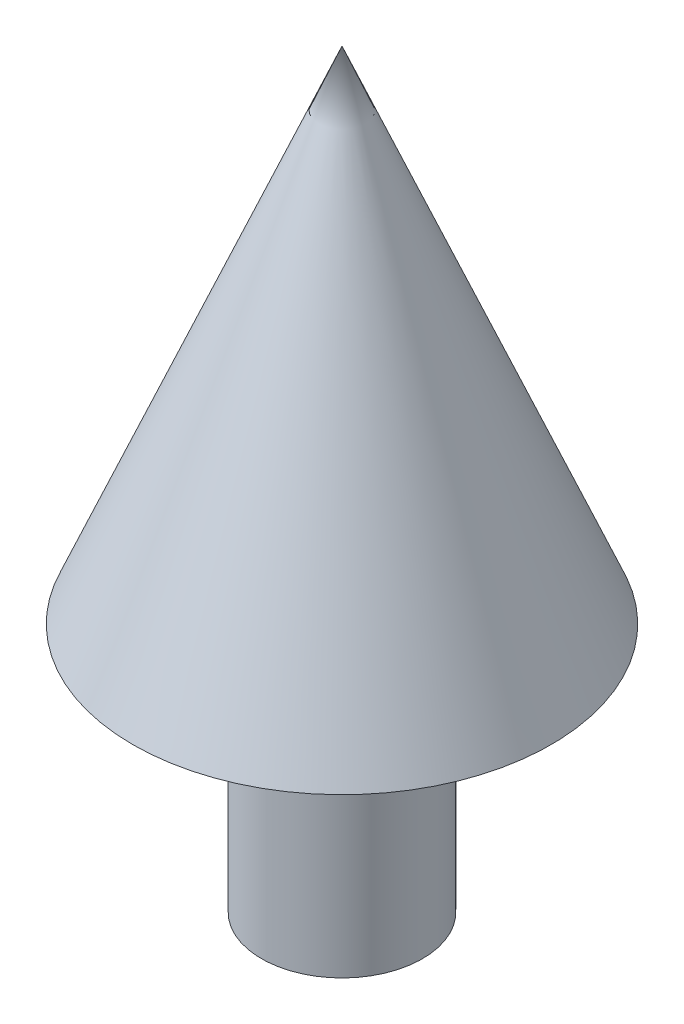
ISO-10303-21;
HEADER;
FILE_DESCRIPTION(('STEP AP214'),'2;1');
FILE_NAME('part.step','',(''),(''),'','','');
FILE_SCHEMA(('AUTOMOTIVE_DESIGN { 1 0 10303 214 1 1 1 1 }'));
ENDSEC;
DATA;
#1=APPLICATION_CONTEXT('core data for automotive mechanical design processes');
#2=APPLICATION_PROTOCOL_DEFINITION('international standard','automotive_design',2000,#1);
#3=PRODUCT_CONTEXT('',#1,'mechanical');
#4=PRODUCT('Part','Part','',(#3));
#5=PRODUCT_RELATED_PRODUCT_CATEGORY('part','',(#4));
#6=PRODUCT_DEFINITION_FORMATION('','',#4);
#7=PRODUCT_DEFINITION_CONTEXT('part definition',#1,'design');
#8=PRODUCT_DEFINITION('design','',#6,#7);
#9=PRODUCT_DEFINITION_SHAPE('','',#8);
#10=(LENGTH_UNIT() NAMED_UNIT(*) SI_UNIT(.MILLI.,.METRE.));
#11=(NAMED_UNIT(*) PLANE_ANGLE_UNIT() SI_UNIT($,.RADIAN.));
#12=(NAMED_UNIT(*) SI_UNIT($,.STERADIAN.) SOLID_ANGLE_UNIT());
#13=UNCERTAINTY_MEASURE_WITH_UNIT(LENGTH_MEASURE(1.E-05),#10,'distance_accuracy_value','');
#14=(GEOMETRIC_REPRESENTATION_CONTEXT(3) GLOBAL_UNCERTAINTY_ASSIGNED_CONTEXT((#13)) GLOBAL_UNIT_ASSIGNED_CONTEXT((#10,
#11,#12)) REPRESENTATION_CONTEXT('',''));
#15=CARTESIAN_POINT('',(0.,0.,0.));
#16=DIRECTION('',(0.,0.,1.));
#17=DIRECTION('',(1.,0.,0.));
#18=AXIS2_PLACEMENT_3D('',#15,#16,#17);
#19=CARTESIAN_POINT('',(98.1479536679539,0.,0.));
#20=DIRECTION('',(0.,-1.,0.));
#21=DIRECTION('',(0.,0.,-1.));
#22=AXIS2_PLACEMENT_3D('',#19,#20,#21);
#23=PLANE('',#22);
#24=CARTESIAN_POINT('',(0.,0.,0.));
#25=DIRECTION('',(0.,-1.,0.));
#26=DIRECTION('',(0.,0.,-1.));
#27=AXIS2_PLACEMENT_3D('',#24,#25,#26);
#28=CIRCLE('',#27,98.1479536679539);
#29=CARTESIAN_POINT('',(0.,0.,-98.1479536679539));
#30=VERTEX_POINT('',#29);
#31=EDGE_CURVE('E63',#30,#30,#28,.T.);
#32=ORIENTED_EDGE('',*,*,#31,.T.);
#33=EDGE_LOOP('',(#32));
#34=FACE_BOUND('',#33,.T.);
#35=ADVANCED_FACE('F39',(#34),#23,.T.);
#36=CARTESIAN_POINT('',(0.,304.329266409267,0.));
#37=DIRECTION('',(0.,-1.,0.));
#38=DIRECTION('',(0.,0.,-1.));
#39=AXIS2_PLACEMENT_3D('',#36,#37,#38);
#40=CONICAL_SURFACE('',#39,254.90223938224,0.39577690760027);
#41=CARTESIAN_POINT('',(0.,914.4,0.));
#42=VERTEX_POINT('',#41);
#43=VERTEX_LOOP('',#42);
#44=FACE_BOUND('',#43,.T.);
#45=CARTESIAN_POINT('',(0.,304.329266409267,0.));
#46=DIRECTION('',(0.,-1.,0.));
#47=DIRECTION('',(0.,0.,-1.));
#48=AXIS2_PLACEMENT_3D('',#45,#46,#47);
#49=CIRCLE('',#48,254.90223938224);
#50=CARTESIAN_POINT('',(0.,304.329266409267,-254.90223938224));
#51=VERTEX_POINT('',#50);
#52=EDGE_CURVE('E11',#51,#51,#49,.T.);
#53=ORIENTED_EDGE('',*,*,#52,.F.);
#54=EDGE_LOOP('',(#53));
#55=FACE_BOUND('',#54,.T.);
#56=ADVANCED_FACE('F49',(#44,#55),#40,.T.);
#57=CARTESIAN_POINT('',(0.,365.0538996139,0.));
#58=DIRECTION('',(0.,-1.,0.));
#59=DIRECTION('',(0.,0.,-1.));
#60=AXIS2_PLACEMENT_3D('',#57,#58,#59);
#61=CONICAL_SURFACE('',#60,98.1479536679539,1.20120995242208);
#62=ORIENTED_EDGE('',*,*,#52,.T.);
#63=EDGE_LOOP('',(#62));
#64=FACE_BOUND('',#63,.T.);
#65=CARTESIAN_POINT('',(0.,365.0538996139,0.));
#66=DIRECTION('',(0.,-1.,0.));
#67=DIRECTION('',(0.,0.,-1.));
#68=AXIS2_PLACEMENT_3D('',#65,#66,#67);
#69=CIRCLE('',#68,98.1479536679539);
#70=CARTESIAN_POINT('',(0.,365.0538996139,-98.1479536679539));
#71=VERTEX_POINT('',#70);
#72=EDGE_CURVE('E46',#71,#71,#69,.T.);
#73=ORIENTED_EDGE('',*,*,#72,.F.);
#74=EDGE_LOOP('',(#73));
#75=FACE_BOUND('',#74,.T.);
#76=ADVANCED_FACE('F52',(#64,#75),#61,.F.);
#77=CARTESIAN_POINT('',(0.,0.,0.));
#78=DIRECTION('',(0.,-1.,0.));
#79=DIRECTION('',(0.,0.,-1.));
#80=AXIS2_PLACEMENT_3D('',#77,#78,#79);
#81=CYLINDRICAL_SURFACE('',#80,98.1479536679539);
#82=ORIENTED_EDGE('',*,*,#72,.T.);
#83=EDGE_LOOP('',(#82));
#84=FACE_BOUND('',#83,.T.);
#85=ORIENTED_EDGE('',*,*,#31,.F.);
#86=EDGE_LOOP('',(#85));
#87=FACE_BOUND('',#86,.T.);
#88=ADVANCED_FACE('F57',(#84,#87),#81,.T.);
#89=CLOSED_SHELL('',(#35,#56,#76,#88));
#90=MANIFOLD_SOLID_BREP('B2',#89);
#91=ADVANCED_BREP_SHAPE_REPRESENTATION('',(#18,#90),#14);
#92=SHAPE_DEFINITION_REPRESENTATION(#9,#91);
ENDSEC;
END-ISO-10303-21;
